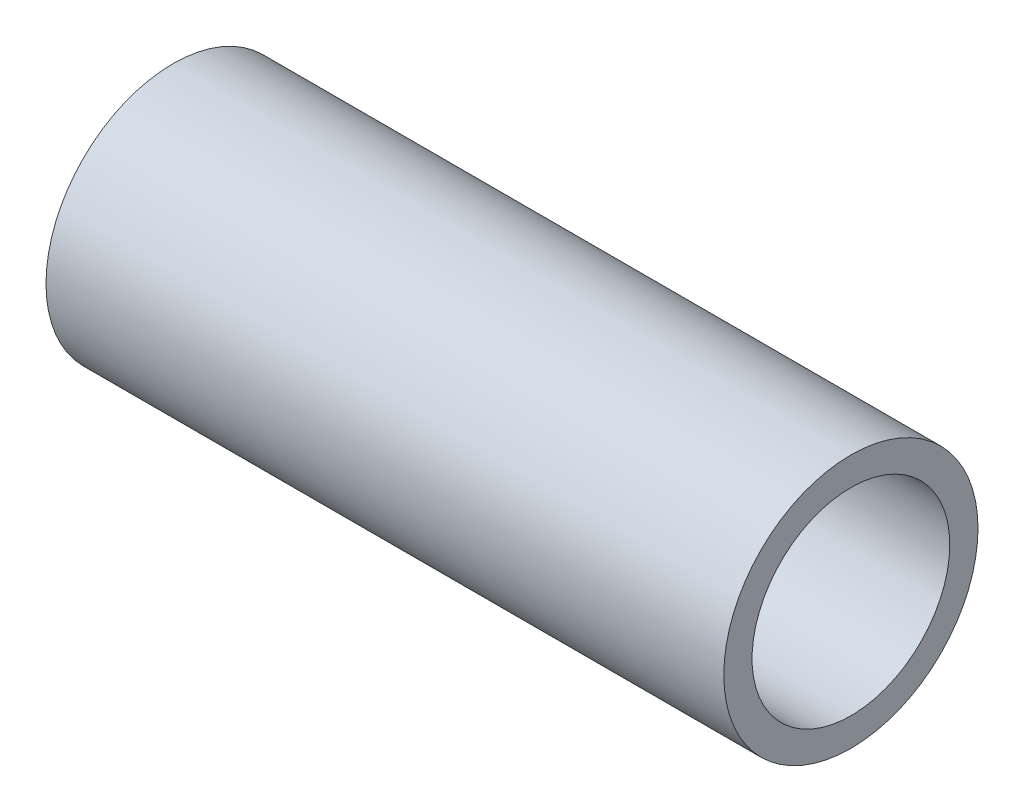
ISO-10303-21;
HEADER;
FILE_DESCRIPTION(('STEP AP214'),'2;1');
FILE_NAME('part.step','',(''),(''),'','','');
FILE_SCHEMA(('AUTOMOTIVE_DESIGN { 1 0 10303 214 1 1 1 1 }'));
ENDSEC;
DATA;
#1=APPLICATION_CONTEXT('core data for automotive mechanical design processes');
#2=APPLICATION_PROTOCOL_DEFINITION('international standard','automotive_design',2000,#1);
#3=PRODUCT_CONTEXT('',#1,'mechanical');
#4=PRODUCT('Part','Part','',(#3));
#5=PRODUCT_RELATED_PRODUCT_CATEGORY('part','',(#4));
#6=PRODUCT_DEFINITION_FORMATION('','',#4);
#7=PRODUCT_DEFINITION_CONTEXT('part definition',#1,'design');
#8=PRODUCT_DEFINITION('design','',#6,#7);
#9=PRODUCT_DEFINITION_SHAPE('','',#8);
#10=(LENGTH_UNIT() NAMED_UNIT(*) SI_UNIT(.MILLI.,.METRE.));
#11=(NAMED_UNIT(*) PLANE_ANGLE_UNIT() SI_UNIT($,.RADIAN.));
#12=(NAMED_UNIT(*) SI_UNIT($,.STERADIAN.) SOLID_ANGLE_UNIT());
#13=UNCERTAINTY_MEASURE_WITH_UNIT(LENGTH_MEASURE(1.E-05),#10,'distance_accuracy_value','');
#14=(GEOMETRIC_REPRESENTATION_CONTEXT(3) GLOBAL_UNCERTAINTY_ASSIGNED_CONTEXT((#13)) GLOBAL_UNIT_ASSIGNED_CONTEXT((#10,
#11,#12)) REPRESENTATION_CONTEXT('',''));
#15=CARTESIAN_POINT('',(0.,0.,0.));
#16=DIRECTION('',(0.,0.,1.));
#17=DIRECTION('',(1.,0.,0.));
#18=AXIS2_PLACEMENT_3D('',#15,#16,#17);
#19=CARTESIAN_POINT('',(96.,0.,0.));
#20=DIRECTION('',(1.,0.,0.));
#21=DIRECTION('',(0.,0.,-1.));
#22=AXIS2_PLACEMENT_3D('',#19,#20,#21);
#23=PLANE('',#22);
#24=CARTESIAN_POINT('',(96.,0.,0.));
#25=DIRECTION('',(1.,0.,0.));
#26=DIRECTION('',(0.,0.,-1.));
#27=AXIS2_PLACEMENT_3D('',#24,#25,#26);
#28=CIRCLE('',#27,36.);
#29=CARTESIAN_POINT('',(96.,0.,-36.));
#30=VERTEX_POINT('',#29);
#31=EDGE_CURVE('E10',#30,#30,#28,.T.);
#32=ORIENTED_EDGE('',*,*,#31,.T.);
#33=EDGE_LOOP('',(#32));
#34=FACE_BOUND('',#33,.T.);
#35=CARTESIAN_POINT('',(96.,0.,0.));
#36=DIRECTION('',(1.,0.,0.));
#37=DIRECTION('',(0.,0.,-1.));
#38=AXIS2_PLACEMENT_3D('',#35,#36,#37);
#39=CIRCLE('',#38,28.);
#40=CARTESIAN_POINT('',(96.,0.,-28.));
#41=VERTEX_POINT('',#40);
#42=EDGE_CURVE('E45',#41,#41,#39,.T.);
#43=ORIENTED_EDGE('',*,*,#42,.F.);
#44=EDGE_LOOP('',(#43));
#45=FACE_BOUND('',#44,.T.);
#46=ADVANCED_FACE('F34',(#34,#45),#23,.T.);
#47=CARTESIAN_POINT('',(-96.,0.,0.));
#48=DIRECTION('',(1.,0.,0.));
#49=DIRECTION('',(0.,0.,-1.));
#50=AXIS2_PLACEMENT_3D('',#47,#48,#49);
#51=PLANE('',#50);
#52=CARTESIAN_POINT('',(-96.,0.,0.));
#53=DIRECTION('',(1.,0.,0.));
#54=DIRECTION('',(0.,0.,-1.));
#55=AXIS2_PLACEMENT_3D('',#52,#53,#54);
#56=CIRCLE('',#55,36.);
#57=CARTESIAN_POINT('',(-96.,0.,-36.));
#58=VERTEX_POINT('',#57);
#59=EDGE_CURVE('E38',#58,#58,#56,.T.);
#60=ORIENTED_EDGE('',*,*,#59,.F.);
#61=EDGE_LOOP('',(#60));
#62=FACE_BOUND('',#61,.T.);
#63=CARTESIAN_POINT('',(-96.,0.,0.));
#64=DIRECTION('',(1.,0.,0.));
#65=DIRECTION('',(0.,0.,-1.));
#66=AXIS2_PLACEMENT_3D('',#63,#64,#65);
#67=CIRCLE('',#66,28.);
#68=CARTESIAN_POINT('',(-96.,0.,-28.));
#69=VERTEX_POINT('',#68);
#70=EDGE_CURVE('E47',#69,#69,#67,.T.);
#71=ORIENTED_EDGE('',*,*,#70,.T.);
#72=EDGE_LOOP('',(#71));
#73=FACE_BOUND('',#72,.T.);
#74=ADVANCED_FACE('F57',(#62,#73),#51,.F.);
#75=CARTESIAN_POINT('',(96.,0.,0.));
#76=DIRECTION('',(-1.,0.,0.));
#77=DIRECTION('',(0.,0.,1.));
#78=AXIS2_PLACEMENT_3D('',#75,#76,#77);
#79=CYLINDRICAL_SURFACE('',#78,36.);
#80=ORIENTED_EDGE('',*,*,#31,.F.);
#81=EDGE_LOOP('',(#80));
#82=FACE_BOUND('',#81,.T.);
#83=ORIENTED_EDGE('',*,*,#59,.T.);
#84=EDGE_LOOP('',(#83));
#85=FACE_BOUND('',#84,.T.);
#86=ADVANCED_FACE('F36',(#82,#85),#79,.T.);
#87=CARTESIAN_POINT('',(96.,0.,0.));
#88=DIRECTION('',(-1.,0.,0.));
#89=DIRECTION('',(0.,0.,1.));
#90=AXIS2_PLACEMENT_3D('',#87,#88,#89);
#91=CYLINDRICAL_SURFACE('',#90,28.);
#92=ORIENTED_EDGE('',*,*,#42,.T.);
#93=EDGE_LOOP('',(#92));
#94=FACE_BOUND('',#93,.T.);
#95=ORIENTED_EDGE('',*,*,#70,.F.);
#96=EDGE_LOOP('',(#95));
#97=FACE_BOUND('',#96,.T.);
#98=ADVANCED_FACE('F53',(#94,#97),#91,.F.);
#99=CLOSED_SHELL('',(#46,#74,#86,#98));
#100=MANIFOLD_SOLID_BREP('B2',#99);
#101=ADVANCED_BREP_SHAPE_REPRESENTATION('',(#18,#100),#14);
#102=SHAPE_DEFINITION_REPRESENTATION(#9,#101);
ENDSEC;
END-ISO-10303-21;
